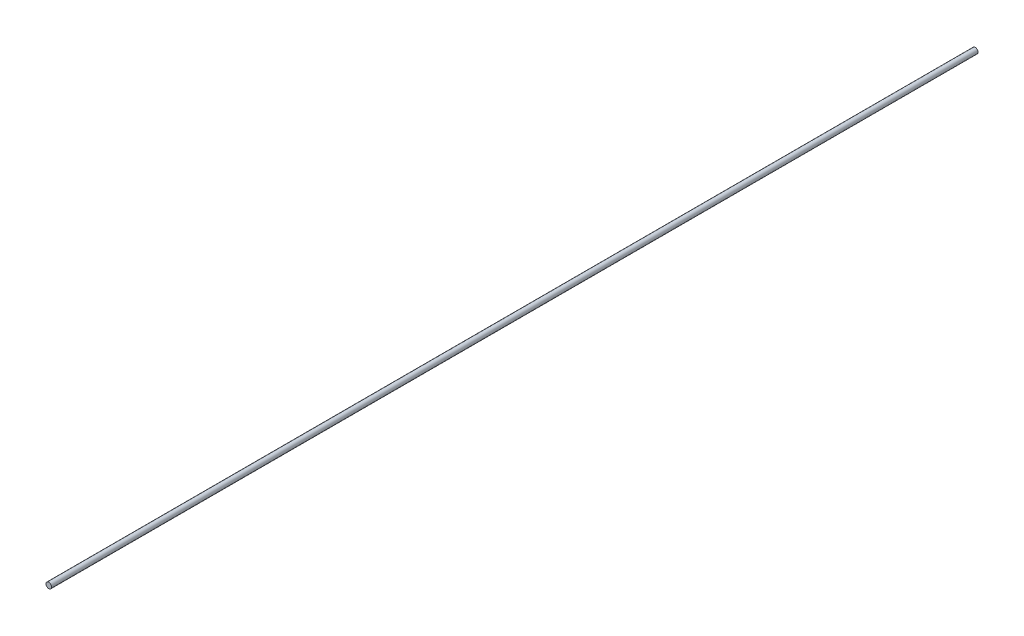
ISO-10303-21;
HEADER;
FILE_DESCRIPTION(('STEP AP214'),'2;1');
FILE_NAME('part.step','',(''),(''),'','','');
FILE_SCHEMA(('AUTOMOTIVE_DESIGN { 1 0 10303 214 1 1 1 1 }'));
ENDSEC;
DATA;
#1=APPLICATION_CONTEXT('core data for automotive mechanical design processes');
#2=APPLICATION_PROTOCOL_DEFINITION('international standard','automotive_design',2000,#1);
#3=PRODUCT_CONTEXT('',#1,'mechanical');
#4=PRODUCT('Part','Part','',(#3));
#5=PRODUCT_RELATED_PRODUCT_CATEGORY('part','',(#4));
#6=PRODUCT_DEFINITION_FORMATION('','',#4);
#7=PRODUCT_DEFINITION_CONTEXT('part definition',#1,'design');
#8=PRODUCT_DEFINITION('design','',#6,#7);
#9=PRODUCT_DEFINITION_SHAPE('','',#8);
#10=(LENGTH_UNIT() NAMED_UNIT(*) SI_UNIT(.MILLI.,.METRE.));
#11=(NAMED_UNIT(*) PLANE_ANGLE_UNIT() SI_UNIT($,.RADIAN.));
#12=(NAMED_UNIT(*) SI_UNIT($,.STERADIAN.) SOLID_ANGLE_UNIT());
#13=UNCERTAINTY_MEASURE_WITH_UNIT(LENGTH_MEASURE(1.E-05),#10,'distance_accuracy_value','');
#14=(GEOMETRIC_REPRESENTATION_CONTEXT(3) GLOBAL_UNCERTAINTY_ASSIGNED_CONTEXT((#13)) GLOBAL_UNIT_ASSIGNED_CONTEXT((#10,
#11,#12)) REPRESENTATION_CONTEXT('',''));
#15=CARTESIAN_POINT('',(0.,0.,0.));
#16=DIRECTION('',(0.,0.,1.));
#17=DIRECTION('',(1.,0.,0.));
#18=AXIS2_PLACEMENT_3D('',#15,#16,#17);
#19=CARTESIAN_POINT('',(0.,0.,300.));
#20=DIRECTION('',(0.,0.,-1.));
#21=DIRECTION('',(-1.,0.,0.));
#22=AXIS2_PLACEMENT_3D('',#19,#20,#21);
#23=CYLINDRICAL_SURFACE('',#22,0.9);
#24=CARTESIAN_POINT('',(0.,0.,300.));
#25=DIRECTION('',(0.,0.,1.));
#26=DIRECTION('',(1.,0.,0.));
#27=AXIS2_PLACEMENT_3D('',#24,#25,#26);
#28=CIRCLE('',#27,0.9);
#29=CARTESIAN_POINT('',(0.9,0.,300.));
#30=VERTEX_POINT('',#29);
#31=EDGE_CURVE('E10',#30,#30,#28,.T.);
#32=ORIENTED_EDGE('',*,*,#31,.F.);
#33=EDGE_LOOP('',(#32));
#34=FACE_BOUND('',#33,.T.);
#35=CARTESIAN_POINT('',(0.,0.,0.));
#36=DIRECTION('',(0.,0.,1.));
#37=DIRECTION('',(1.,0.,0.));
#38=AXIS2_PLACEMENT_3D('',#35,#36,#37);
#39=CIRCLE('',#38,0.9);
#40=CARTESIAN_POINT('',(0.9,0.,0.));
#41=VERTEX_POINT('',#40);
#42=EDGE_CURVE('E35',#41,#41,#39,.T.);
#43=ORIENTED_EDGE('',*,*,#42,.T.);
#44=EDGE_LOOP('',(#43));
#45=FACE_BOUND('',#44,.T.);
#46=ADVANCED_FACE('F32',(#34,#45),#23,.T.);
#47=CARTESIAN_POINT('',(0.,0.,300.));
#48=DIRECTION('',(0.,0.,1.));
#49=DIRECTION('',(1.,0.,0.));
#50=AXIS2_PLACEMENT_3D('',#47,#48,#49);
#51=PLANE('',#50);
#52=ORIENTED_EDGE('',*,*,#31,.T.);
#53=EDGE_LOOP('',(#52));
#54=FACE_BOUND('',#53,.T.);
#55=ADVANCED_FACE('F47',(#54),#51,.T.);
#56=CARTESIAN_POINT('',(0.,0.,0.));
#57=DIRECTION('',(0.,0.,1.));
#58=DIRECTION('',(1.,0.,0.));
#59=AXIS2_PLACEMENT_3D('',#56,#57,#58);
#60=PLANE('',#59);
#61=ORIENTED_EDGE('',*,*,#42,.F.);
#62=EDGE_LOOP('',(#61));
#63=FACE_BOUND('',#62,.T.);
#64=ADVANCED_FACE('F45',(#63),#60,.F.);
#65=CLOSED_SHELL('',(#46,#55,#64));
#66=MANIFOLD_SOLID_BREP('B2',#65);
#67=ADVANCED_BREP_SHAPE_REPRESENTATION('',(#18,#66),#14);
#68=SHAPE_DEFINITION_REPRESENTATION(#9,#67);
ENDSEC;
END-ISO-10303-21;
